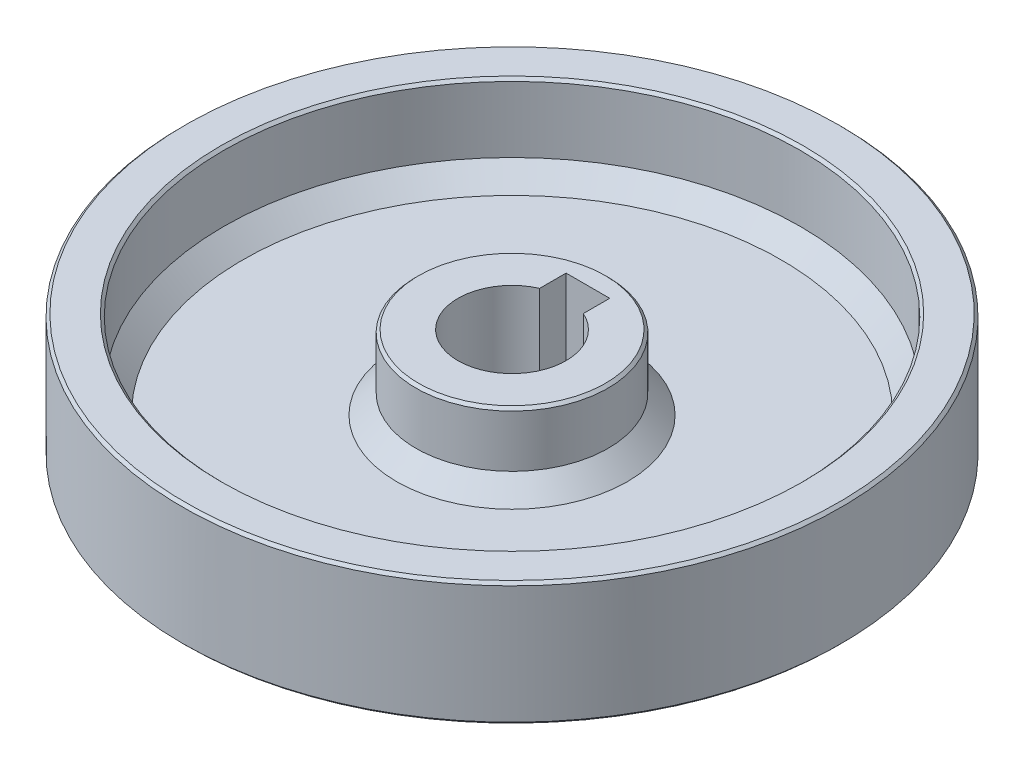
ISO-10303-21;
HEADER;
FILE_DESCRIPTION(('STEP AP214'),'2;1');
FILE_NAME('part.step','',(''),(''),'','','');
FILE_SCHEMA(('AUTOMOTIVE_DESIGN { 1 0 10303 214 1 1 1 1 }'));
ENDSEC;
DATA;
#1=APPLICATION_CONTEXT('core data for automotive mechanical design processes');
#2=APPLICATION_PROTOCOL_DEFINITION('international standard','automotive_design',2000,#1);
#3=PRODUCT_CONTEXT('',#1,'mechanical');
#4=PRODUCT('Part','Part','',(#3));
#5=PRODUCT_RELATED_PRODUCT_CATEGORY('part','',(#4));
#6=PRODUCT_DEFINITION_FORMATION('','',#4);
#7=PRODUCT_DEFINITION_CONTEXT('part definition',#1,'design');
#8=PRODUCT_DEFINITION('design','',#6,#7);
#9=PRODUCT_DEFINITION_SHAPE('','',#8);
#10=(LENGTH_UNIT() NAMED_UNIT(*) SI_UNIT(.MILLI.,.METRE.));
#11=(NAMED_UNIT(*) PLANE_ANGLE_UNIT() SI_UNIT($,.RADIAN.));
#12=(NAMED_UNIT(*) SI_UNIT($,.STERADIAN.) SOLID_ANGLE_UNIT());
#13=UNCERTAINTY_MEASURE_WITH_UNIT(LENGTH_MEASURE(1.E-05),#10,'distance_accuracy_value','');
#14=(GEOMETRIC_REPRESENTATION_CONTEXT(3) GLOBAL_UNCERTAINTY_ASSIGNED_CONTEXT((#13)) GLOBAL_UNIT_ASSIGNED_CONTEXT((#10,
#11,#12)) REPRESENTATION_CONTEXT('',''));
#15=CARTESIAN_POINT('',(0.,0.,0.));
#16=DIRECTION('',(0.,0.,1.));
#17=DIRECTION('',(1.,0.,0.));
#18=AXIS2_PLACEMENT_3D('',#15,#16,#17);
#19=CARTESIAN_POINT('',(0.,5.08000000000003,0.));
#20=DIRECTION('',(0.,1.,0.));
#21=DIRECTION('',(0.,0.,1.));
#22=AXIS2_PLACEMENT_3D('',#19,#20,#21);
#23=CONICAL_SURFACE('',#22,26.67,0.785398163397441);
#24=CARTESIAN_POINT('',(0.,5.08000000000003,0.));
#25=DIRECTION('',(0.,-1.,0.));
#26=DIRECTION('',(0.,0.,-1.));
#27=AXIS2_PLACEMENT_3D('',#24,#25,#26);
#28=CIRCLE('',#27,26.67);
#29=CARTESIAN_POINT('',(0.,5.08000000000003,-26.67));
#30=VERTEX_POINT('',#29);
#31=EDGE_CURVE('E122',#30,#30,#28,.F.);
#32=ORIENTED_EDGE('',*,*,#31,.T.);
#33=EDGE_LOOP('',(#32));
#34=FACE_BOUND('',#33,.T.);
#35=CARTESIAN_POINT('',(0.,3.302,0.));
#36=DIRECTION('',(0.,1.,0.));
#37=DIRECTION('',(0.,0.,1.));
#38=AXIS2_PLACEMENT_3D('',#35,#36,#37);
#39=CIRCLE('',#38,24.892);
#40=CARTESIAN_POINT('',(0.,3.302,24.892));
#41=VERTEX_POINT('',#40);
#42=EDGE_CURVE('E20',#41,#41,#39,.F.);
#43=ORIENTED_EDGE('',*,*,#42,.T.);
#44=EDGE_LOOP('',(#43));
#45=FACE_BOUND('',#44,.T.);
#46=ADVANCED_FACE('F17',(#34,#45),#23,.F.);
#47=CARTESIAN_POINT('',(0.,0.,0.));
#48=DIRECTION('',(0.,-1.,0.));
#49=DIRECTION('',(0.,0.,-1.));
#50=AXIS2_PLACEMENT_3D('',#47,#48,#49);
#51=CYLINDRICAL_SURFACE('',#50,26.67);
#52=CARTESIAN_POINT('',(0.,11.176,0.));
#53=DIRECTION('',(0.,1.,0.));
#54=DIRECTION('',(0.,0.,1.));
#55=AXIS2_PLACEMENT_3D('',#52,#53,#54);
#56=CIRCLE('',#55,26.67);
#57=CARTESIAN_POINT('',(0.,11.176,26.67));
#58=VERTEX_POINT('',#57);
#59=EDGE_CURVE('E118',#58,#58,#56,.T.);
#60=ORIENTED_EDGE('',*,*,#59,.T.);
#61=EDGE_LOOP('',(#60));
#62=FACE_BOUND('',#61,.T.);
#63=ORIENTED_EDGE('',*,*,#31,.F.);
#64=EDGE_LOOP('',(#63));
#65=FACE_BOUND('',#64,.T.);
#66=ADVANCED_FACE('F144',(#62,#65),#51,.F.);
#67=CARTESIAN_POINT('',(24.892,3.302,0.));
#68=DIRECTION('',(0.,-1.,0.));
#69=DIRECTION('',(0.,0.,-1.));
#70=AXIS2_PLACEMENT_3D('',#67,#68,#69);
#71=PLANE('',#70);
#72=CARTESIAN_POINT('',(0.,3.302,0.));
#73=DIRECTION('',(0.,-1.,0.));
#74=DIRECTION('',(0.,0.,-1.));
#75=AXIS2_PLACEMENT_3D('',#72,#73,#74);
#76=CIRCLE('',#75,10.668);
#77=CARTESIAN_POINT('',(0.,3.302,-10.668));
#78=VERTEX_POINT('',#77);
#79=EDGE_CURVE('E121',#78,#78,#76,.F.);
#80=ORIENTED_EDGE('',*,*,#79,.F.);
#81=EDGE_LOOP('',(#80));
#82=FACE_BOUND('',#81,.T.);
#83=ORIENTED_EDGE('',*,*,#42,.F.);
#84=EDGE_LOOP('',(#83));
#85=FACE_BOUND('',#84,.T.);
#86=ADVANCED_FACE('F140',(#82,#85),#71,.F.);
#87=CARTESIAN_POINT('',(0.,11.43,0.));
#88=DIRECTION('',(0.,1.,0.));
#89=DIRECTION('',(-1.,0.,0.));
#90=AXIS2_PLACEMENT_3D('',#87,#88,#89);
#91=CONICAL_SURFACE('',#90,26.924,0.785398163397438);
#92=ORIENTED_EDGE('',*,*,#59,.F.);
#93=EDGE_LOOP('',(#92));
#94=FACE_BOUND('',#93,.T.);
#95=CARTESIAN_POINT('',(0.,11.43,0.));
#96=DIRECTION('',(0.,1.,0.));
#97=DIRECTION('',(-1.,0.,0.));
#98=AXIS2_PLACEMENT_3D('',#95,#96,#97);
#99=CIRCLE('',#98,26.924);
#100=CARTESIAN_POINT('',(-26.924,11.43,0.));
#101=VERTEX_POINT('',#100);
#102=EDGE_CURVE('E117',#101,#101,#99,.F.);
#103=ORIENTED_EDGE('',*,*,#102,.F.);
#104=EDGE_LOOP('',(#103));
#105=FACE_BOUND('',#104,.T.);
#106=ADVANCED_FACE('F143',(#94,#105),#91,.F.);
#107=CARTESIAN_POINT('',(0.,3.302,0.));
#108=DIRECTION('',(0.,-1.,0.));
#109=DIRECTION('',(0.,0.,-1.));
#110=AXIS2_PLACEMENT_3D('',#107,#108,#109);
#111=CONICAL_SURFACE('',#110,10.668,0.78539816339745);
#112=ORIENTED_EDGE('',*,*,#79,.T.);
#113=EDGE_LOOP('',(#112));
#114=FACE_BOUND('',#113,.T.);
#115=CARTESIAN_POINT('',(0.,5.08,0.));
#116=DIRECTION('',(0.,-1.,0.));
#117=DIRECTION('',(0.,0.,-1.));
#118=AXIS2_PLACEMENT_3D('',#115,#116,#117);
#119=CIRCLE('',#118,8.89);
#120=CARTESIAN_POINT('',(0.,5.08,-8.89));
#121=VERTEX_POINT('',#120);
#122=EDGE_CURVE('E114',#121,#121,#119,.F.);
#123=ORIENTED_EDGE('',*,*,#122,.F.);
#124=EDGE_LOOP('',(#123));
#125=FACE_BOUND('',#124,.T.);
#126=ADVANCED_FACE('F137',(#114,#125),#111,.T.);
#127=CARTESIAN_POINT('',(0.,11.43,0.));
#128=DIRECTION('',(0.,1.,0.));
#129=DIRECTION('',(0.,0.,1.));
#130=AXIS2_PLACEMENT_3D('',#127,#128,#129);
#131=PLANE('',#130);
#132=CARTESIAN_POINT('',(0.,11.43,0.));
#133=DIRECTION('',(0.,-1.,0.));
#134=DIRECTION('',(0.,0.,-1.));
#135=AXIS2_PLACEMENT_3D('',#132,#133,#134);
#136=CIRCLE('',#135,30.226);
#137=CARTESIAN_POINT('',(0.,11.43,-30.226));
#138=VERTEX_POINT('',#137);
#139=EDGE_CURVE('E113',#138,#138,#136,.T.);
#140=ORIENTED_EDGE('',*,*,#139,.F.);
#141=EDGE_LOOP('',(#140));
#142=FACE_BOUND('',#141,.T.);
#143=ORIENTED_EDGE('',*,*,#102,.T.);
#144=EDGE_LOOP('',(#143));
#145=FACE_BOUND('',#144,.T.);
#146=ADVANCED_FACE('F196',(#142,#145),#131,.T.);
#147=CARTESIAN_POINT('',(0.,0.,0.));
#148=DIRECTION('',(0.,-1.,0.));
#149=DIRECTION('',(0.,0.,-1.));
#150=AXIS2_PLACEMENT_3D('',#147,#148,#149);
#151=CYLINDRICAL_SURFACE('',#150,8.89);
#152=ORIENTED_EDGE('',*,*,#122,.T.);
#153=EDGE_LOOP('',(#152));
#154=FACE_BOUND('',#153,.T.);
#155=CARTESIAN_POINT('',(0.,9.90599999999998,0.));
#156=DIRECTION('',(0.,-1.,0.));
#157=DIRECTION('',(0.,0.,-1.));
#158=AXIS2_PLACEMENT_3D('',#155,#156,#157);
#159=CIRCLE('',#158,8.89);
#160=CARTESIAN_POINT('',(0.,9.90599999999998,-8.89));
#161=VERTEX_POINT('',#160);
#162=EDGE_CURVE('E110',#161,#161,#159,.F.);
#163=ORIENTED_EDGE('',*,*,#162,.F.);
#164=EDGE_LOOP('',(#163));
#165=FACE_BOUND('',#164,.T.);
#166=ADVANCED_FACE('F192',(#154,#165),#151,.T.);
#167=CARTESIAN_POINT('',(0.,11.176,0.));
#168=DIRECTION('',(0.,-1.,0.));
#169=DIRECTION('',(0.,0.,-1.));
#170=AXIS2_PLACEMENT_3D('',#167,#168,#169);
#171=CONICAL_SURFACE('',#170,30.48,0.785398163397469);
#172=ORIENTED_EDGE('',*,*,#139,.T.);
#173=EDGE_LOOP('',(#172));
#174=FACE_BOUND('',#173,.T.);
#175=CARTESIAN_POINT('',(0.,11.176,0.));
#176=DIRECTION('',(0.,-1.,0.));
#177=DIRECTION('',(0.,0.,-1.));
#178=AXIS2_PLACEMENT_3D('',#175,#176,#177);
#179=CIRCLE('',#178,30.48);
#180=CARTESIAN_POINT('',(0.,11.176,-30.48));
#181=VERTEX_POINT('',#180);
#182=EDGE_CURVE('E107',#181,#181,#179,.T.);
#183=ORIENTED_EDGE('',*,*,#182,.F.);
#184=EDGE_LOOP('',(#183));
#185=FACE_BOUND('',#184,.T.);
#186=ADVANCED_FACE('F188',(#174,#185),#171,.T.);
#187=CARTESIAN_POINT('',(0.,9.90599999999998,0.));
#188=DIRECTION('',(0.,-1.,0.));
#189=DIRECTION('',(0.,0.,-1.));
#190=AXIS2_PLACEMENT_3D('',#187,#188,#189);
#191=CONICAL_SURFACE('',#190,8.89,0.785398163397435);
#192=ORIENTED_EDGE('',*,*,#162,.T.);
#193=EDGE_LOOP('',(#192));
#194=FACE_BOUND('',#193,.T.);
#195=CARTESIAN_POINT('',(0.,10.16,0.));
#196=DIRECTION('',(0.,-1.,0.));
#197=DIRECTION('',(0.,0.,-1.));
#198=AXIS2_PLACEMENT_3D('',#195,#196,#197);
#199=CIRCLE('',#198,8.63599999999998);
#200=CARTESIAN_POINT('',(0.,10.16,-8.63599999999998));
#201=VERTEX_POINT('',#200);
#202=EDGE_CURVE('E106',#201,#201,#199,.F.);
#203=ORIENTED_EDGE('',*,*,#202,.F.);
#204=EDGE_LOOP('',(#203));
#205=FACE_BOUND('',#204,.T.);
#206=ADVANCED_FACE('F184',(#194,#205),#191,.T.);
#207=CARTESIAN_POINT('',(0.,11.43,0.));
#208=DIRECTION('',(0.,-1.,0.));
#209=DIRECTION('',(0.,0.,-1.));
#210=AXIS2_PLACEMENT_3D('',#207,#208,#209);
#211=CYLINDRICAL_SURFACE('',#210,30.48);
#212=ORIENTED_EDGE('',*,*,#182,.T.);
#213=EDGE_LOOP('',(#212));
#214=FACE_BOUND('',#213,.T.);
#215=CARTESIAN_POINT('',(0.,0.254000000000004,0.));
#216=DIRECTION('',(0.,1.,0.));
#217=DIRECTION('',(0.,0.,1.));
#218=AXIS2_PLACEMENT_3D('',#215,#216,#217);
#219=CIRCLE('',#218,30.48);
#220=CARTESIAN_POINT('',(0.,0.254000000000005,30.48));
#221=VERTEX_POINT('',#220);
#222=EDGE_CURVE('E101',#221,#221,#219,.F.);
#223=ORIENTED_EDGE('',*,*,#222,.F.);
#224=EDGE_LOOP('',(#223));
#225=FACE_BOUND('',#224,.T.);
#226=ADVANCED_FACE('F181',(#214,#225),#211,.T.);
#227=CARTESIAN_POINT('',(0.,10.16,0.));
#228=DIRECTION('',(0.,1.,0.));
#229=DIRECTION('',(0.,0.,1.));
#230=AXIS2_PLACEMENT_3D('',#227,#228,#229);
#231=PLANE('',#230);
#232=DIRECTION('',(0.,0.,-1.));
#233=VECTOR('',#232,1.);
#234=CARTESIAN_POINT('',(2.0193,10.16,-7.0193));
#235=LINE('',#234,#233);
#236=CARTESIAN_POINT('',(2.0193,10.16,-7.0193));
#237=VERTEX_POINT('',#236);
#238=CARTESIAN_POINT('',(2.0193,10.16,-4.57410401171639));
#239=VERTEX_POINT('',#238);
#240=EDGE_CURVE('E55',#237,#239,#235,.F.);
#241=ORIENTED_EDGE('',*,*,#240,.T.);
#242=CARTESIAN_POINT('',(0.,10.16,0.));
#243=DIRECTION('',(0.,-1.,0.));
#244=DIRECTION('',(0.,0.,-1.));
#245=AXIS2_PLACEMENT_3D('',#242,#243,#244);
#246=CIRCLE('',#245,5.);
#247=CARTESIAN_POINT('',(-2.0193,10.16,-4.57410401171639));
#248=VERTEX_POINT('',#247);
#249=EDGE_CURVE('E57',#239,#248,#246,.T.);
#250=ORIENTED_EDGE('',*,*,#249,.T.);
#251=DIRECTION('',(0.,0.,1.));
#252=VECTOR('',#251,1.);
#253=CARTESIAN_POINT('',(-2.0193,10.16,-7.0193));
#254=LINE('',#253,#252);
#255=CARTESIAN_POINT('',(-2.0193,10.16,-7.0193));
#256=VERTEX_POINT('',#255);
#257=EDGE_CURVE('E61',#248,#256,#254,.F.);
#258=ORIENTED_EDGE('',*,*,#257,.T.);
#259=DIRECTION('',(-1.,0.,0.));
#260=VECTOR('',#259,1.);
#261=CARTESIAN_POINT('',(-2.0193,10.16,-7.0193));
#262=LINE('',#261,#260);
#263=EDGE_CURVE('E86',#256,#237,#262,.F.);
#264=ORIENTED_EDGE('',*,*,#263,.T.);
#265=EDGE_LOOP('',(#241,#250,#258,#264));
#266=FACE_BOUND('',#265,.T.);
#267=ORIENTED_EDGE('',*,*,#202,.T.);
#268=EDGE_LOOP('',(#267));
#269=FACE_BOUND('',#268,.T.);
#270=ADVANCED_FACE('F59',(#266,#269),#231,.T.);
#271=CARTESIAN_POINT('',(0.,0.254000000000005,0.));
#272=DIRECTION('',(0.,1.,0.));
#273=DIRECTION('',(0.,0.,1.));
#274=AXIS2_PLACEMENT_3D('',#271,#272,#273);
#275=CONICAL_SURFACE('',#274,30.48,0.785398163397441);
#276=CARTESIAN_POINT('',(0.,0.,0.));
#277=DIRECTION('',(0.,1.,0.));
#278=DIRECTION('',(0.,0.,1.));
#279=AXIS2_PLACEMENT_3D('',#276,#277,#278);
#280=CIRCLE('',#279,30.226);
#281=CARTESIAN_POINT('',(0.,0.,30.226));
#282=VERTEX_POINT('',#281);
#283=EDGE_CURVE('E97',#282,#282,#280,.T.);
#284=ORIENTED_EDGE('',*,*,#283,.T.);
#285=EDGE_LOOP('',(#284));
#286=FACE_BOUND('',#285,.T.);
#287=ORIENTED_EDGE('',*,*,#222,.T.);
#288=EDGE_LOOP('',(#287));
#289=FACE_BOUND('',#288,.T.);
#290=ADVANCED_FACE('F174',(#286,#289),#275,.T.);
#291=CARTESIAN_POINT('',(2.0193,0.,-7.0193));
#292=DIRECTION('',(1.,0.,0.));
#293=DIRECTION('',(0.,0.,-1.));
#294=AXIS2_PLACEMENT_3D('',#291,#292,#293);
#295=PLANE('',#294);
#296=DIRECTION('',(0.,1.,0.));
#297=VECTOR('',#296,1.);
#298=CARTESIAN_POINT('',(2.0193,0.,-7.0193));
#299=LINE('',#298,#297);
#300=CARTESIAN_POINT('',(2.0193,0.,-7.0193));
#301=VERTEX_POINT('',#300);
#302=EDGE_CURVE('E72',#237,#301,#299,.F.);
#303=ORIENTED_EDGE('',*,*,#302,.T.);
#304=DIRECTION('',(0.,0.,1.));
#305=VECTOR('',#304,1.);
#306=CARTESIAN_POINT('',(2.0193,0.,0.));
#307=LINE('',#306,#305);
#308=CARTESIAN_POINT('',(2.0193,0.,-4.57410401171639));
#309=VERTEX_POINT('',#308);
#310=EDGE_CURVE('E126',#301,#309,#307,.T.);
#311=ORIENTED_EDGE('',*,*,#310,.T.);
#312=DIRECTION('',(0.,-1.,0.));
#313=VECTOR('',#312,1.);
#314=CARTESIAN_POINT('',(2.0193,11.43,-4.57410401171639));
#315=LINE('',#314,#313);
#316=EDGE_CURVE('E66',#309,#239,#315,.F.);
#317=ORIENTED_EDGE('',*,*,#316,.T.);
#318=ORIENTED_EDGE('',*,*,#240,.F.);
#319=EDGE_LOOP('',(#303,#311,#317,#318));
#320=FACE_BOUND('',#319,.T.);
#321=ADVANCED_FACE('F171',(#320),#295,.F.);
#322=CARTESIAN_POINT('',(0.,11.43,0.));
#323=DIRECTION('',(0.,-1.,0.));
#324=DIRECTION('',(0.,0.,-1.));
#325=AXIS2_PLACEMENT_3D('',#322,#323,#324);
#326=CYLINDRICAL_SURFACE('',#325,5.);
#327=ORIENTED_EDGE('',*,*,#249,.F.);
#328=ORIENTED_EDGE('',*,*,#316,.F.);
#329=CARTESIAN_POINT('',(0.,0.,0.));
#330=DIRECTION('',(0.,-1.,0.));
#331=DIRECTION('',(0.,0.,-1.));
#332=AXIS2_PLACEMENT_3D('',#329,#330,#331);
#333=CIRCLE('',#332,5.);
#334=CARTESIAN_POINT('',(-2.0193,0.,-4.57410401171639));
#335=VERTEX_POINT('',#334);
#336=EDGE_CURVE('E77',#309,#335,#333,.T.);
#337=ORIENTED_EDGE('',*,*,#336,.T.);
#338=DIRECTION('',(0.,1.,0.));
#339=VECTOR('',#338,1.);
#340=CARTESIAN_POINT('',(-2.0193,0.,-4.57410401171639));
#341=LINE('',#340,#339);
#342=EDGE_CURVE('E65',#335,#248,#341,.T.);
#343=ORIENTED_EDGE('',*,*,#342,.T.);
#344=EDGE_LOOP('',(#327,#328,#337,#343));
#345=FACE_BOUND('',#344,.T.);
#346=ADVANCED_FACE('F75',(#345),#326,.F.);
#347=CARTESIAN_POINT('',(-2.0193,0.,-7.0193));
#348=DIRECTION('',(-1.,0.,0.));
#349=DIRECTION('',(0.,0.,1.));
#350=AXIS2_PLACEMENT_3D('',#347,#348,#349);
#351=PLANE('',#350);
#352=ORIENTED_EDGE('',*,*,#342,.F.);
#353=DIRECTION('',(0.,0.,1.));
#354=VECTOR('',#353,1.);
#355=CARTESIAN_POINT('',(-2.0193,0.,0.));
#356=LINE('',#355,#354);
#357=CARTESIAN_POINT('',(-2.0193,0.,-7.0193));
#358=VERTEX_POINT('',#357);
#359=EDGE_CURVE('E26',#335,#358,#356,.F.);
#360=ORIENTED_EDGE('',*,*,#359,.T.);
#361=DIRECTION('',(0.,1.,0.));
#362=VECTOR('',#361,1.);
#363=CARTESIAN_POINT('',(-2.0193,0.,-7.0193));
#364=LINE('',#363,#362);
#365=EDGE_CURVE('E34',#358,#256,#364,.T.);
#366=ORIENTED_EDGE('',*,*,#365,.T.);
#367=ORIENTED_EDGE('',*,*,#257,.F.);
#368=EDGE_LOOP('',(#352,#360,#366,#367));
#369=FACE_BOUND('',#368,.T.);
#370=ADVANCED_FACE('F69',(#369),#351,.F.);
#371=CARTESIAN_POINT('',(-2.0193,0.,-7.0193));
#372=DIRECTION('',(0.,0.,-1.));
#373=DIRECTION('',(-1.,0.,0.));
#374=AXIS2_PLACEMENT_3D('',#371,#372,#373);
#375=PLANE('',#374);
#376=ORIENTED_EDGE('',*,*,#365,.F.);
#377=DIRECTION('',(1.,0.,0.));
#378=VECTOR('',#377,1.);
#379=CARTESIAN_POINT('',(0.,0.,-7.0193));
#380=LINE('',#379,#378);
#381=EDGE_CURVE('E11',#358,#301,#380,.T.);
#382=ORIENTED_EDGE('',*,*,#381,.T.);
#383=ORIENTED_EDGE('',*,*,#302,.F.);
#384=ORIENTED_EDGE('',*,*,#263,.F.);
#385=EDGE_LOOP('',(#376,#382,#383,#384));
#386=FACE_BOUND('',#385,.T.);
#387=ADVANCED_FACE('F158',(#386),#375,.F.);
#388=CARTESIAN_POINT('',(0.,0.,0.));
#389=DIRECTION('',(0.,1.,0.));
#390=DIRECTION('',(0.,0.,1.));
#391=AXIS2_PLACEMENT_3D('',#388,#389,#390);
#392=PLANE('',#391);
#393=ORIENTED_EDGE('',*,*,#359,.F.);
#394=ORIENTED_EDGE('',*,*,#336,.F.);
#395=ORIENTED_EDGE('',*,*,#310,.F.);
#396=ORIENTED_EDGE('',*,*,#381,.F.);
#397=EDGE_LOOP('',(#393,#394,#395,#396));
#398=FACE_BOUND('',#397,.T.);
#399=ORIENTED_EDGE('',*,*,#283,.F.);
#400=EDGE_LOOP('',(#399));
#401=FACE_BOUND('',#400,.T.);
#402=ADVANCED_FACE('F156',(#398,#401),#392,.F.);
#403=CLOSED_SHELL('',(#46,#66,#86,#106,#126,#146,#166,#186,#206,#226,#270,#290,#321,#346,#370,
#387,#402));
#404=MANIFOLD_SOLID_BREP('B1',#403);
#405=ADVANCED_BREP_SHAPE_REPRESENTATION('',(#18,#404),#14);
#406=SHAPE_DEFINITION_REPRESENTATION(#9,#405);
ENDSEC;
END-ISO-10303-21;
